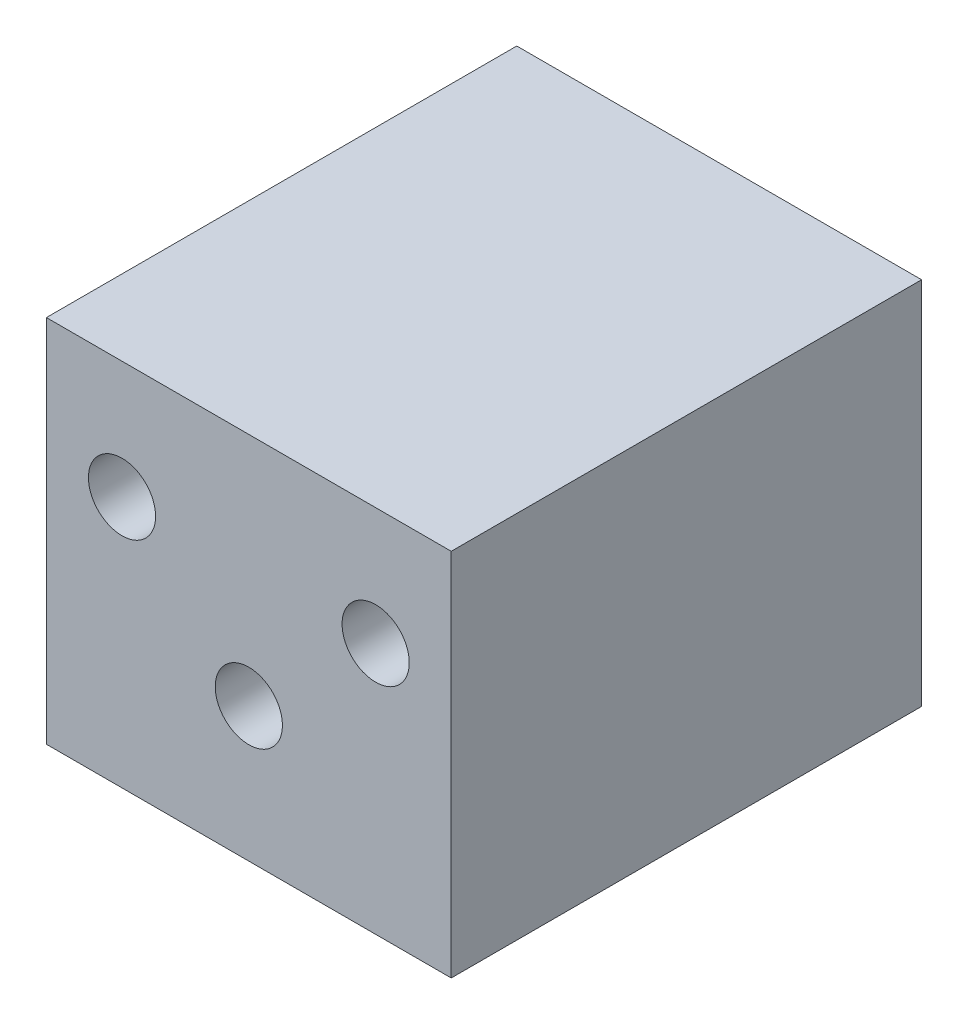
ISO-10303-21;
HEADER;
FILE_DESCRIPTION(('STEP AP214'),'2;1');
FILE_NAME('part.step','',(''),(''),'','','');
FILE_SCHEMA(('AUTOMOTIVE_DESIGN { 1 0 10303 214 1 1 1 1 }'));
ENDSEC;
DATA;
#1=APPLICATION_CONTEXT('core data for automotive mechanical design processes');
#2=APPLICATION_PROTOCOL_DEFINITION('international standard','automotive_design',2000,#1);
#3=PRODUCT_CONTEXT('',#1,'mechanical');
#4=PRODUCT('Part','Part','',(#3));
#5=PRODUCT_RELATED_PRODUCT_CATEGORY('part','',(#4));
#6=PRODUCT_DEFINITION_FORMATION('','',#4);
#7=PRODUCT_DEFINITION_CONTEXT('part definition',#1,'design');
#8=PRODUCT_DEFINITION('design','',#6,#7);
#9=PRODUCT_DEFINITION_SHAPE('','',#8);
#10=(LENGTH_UNIT() NAMED_UNIT(*) SI_UNIT(.MILLI.,.METRE.));
#11=(NAMED_UNIT(*) PLANE_ANGLE_UNIT() SI_UNIT($,.RADIAN.));
#12=(NAMED_UNIT(*) SI_UNIT($,.STERADIAN.) SOLID_ANGLE_UNIT());
#13=UNCERTAINTY_MEASURE_WITH_UNIT(LENGTH_MEASURE(1.E-05),#10,'distance_accuracy_value','');
#14=(GEOMETRIC_REPRESENTATION_CONTEXT(3) GLOBAL_UNCERTAINTY_ASSIGNED_CONTEXT((#13)) GLOBAL_UNIT_ASSIGNED_CONTEXT((#10,
#11,#12)) REPRESENTATION_CONTEXT('',''));
#15=CARTESIAN_POINT('',(0.,0.,0.));
#16=DIRECTION('',(0.,0.,1.));
#17=DIRECTION('',(1.,0.,0.));
#18=AXIS2_PLACEMENT_3D('',#15,#16,#17);
#19=CARTESIAN_POINT('',(0.,0.,28.));
#20=DIRECTION('',(0.,0.,1.));
#21=DIRECTION('',(1.,0.,0.));
#22=AXIS2_PLACEMENT_3D('',#19,#20,#21);
#23=PLANE('',#22);
#24=CARTESIAN_POINT('',(0.,-3.,28.));
#25=DIRECTION('',(0.,0.,1.));
#26=DIRECTION('',(1.,0.,0.));
#27=AXIS2_PLACEMENT_3D('',#24,#25,#26);
#28=CIRCLE('',#27,2.);
#29=CARTESIAN_POINT('',(2.,-3.,28.));
#30=VERTEX_POINT('',#29);
#31=EDGE_CURVE('E152',#30,#30,#28,.T.);
#32=ORIENTED_EDGE('',*,*,#31,.F.);
#33=EDGE_LOOP('',(#32));
#34=FACE_BOUND('',#33,.T.);
#35=CARTESIAN_POINT('',(-7.55,4.,28.));
#36=DIRECTION('',(0.,0.,1.));
#37=DIRECTION('',(1.,0.,0.));
#38=AXIS2_PLACEMENT_3D('',#35,#36,#37);
#39=CIRCLE('',#38,2.);
#40=CARTESIAN_POINT('',(-5.55,4.,28.));
#41=VERTEX_POINT('',#40);
#42=EDGE_CURVE('E118',#41,#41,#39,.T.);
#43=ORIENTED_EDGE('',*,*,#42,.F.);
#44=EDGE_LOOP('',(#43));
#45=FACE_BOUND('',#44,.T.);
#46=DIRECTION('',(0.,1.,0.));
#47=VECTOR('',#46,1.);
#48=CARTESIAN_POINT('',(12.05,11.,28.));
#49=LINE('',#48,#47);
#50=CARTESIAN_POINT('',(12.05,-11.,28.));
#51=VERTEX_POINT('',#50);
#52=CARTESIAN_POINT('',(12.05,11.,28.));
#53=VERTEX_POINT('',#52);
#54=EDGE_CURVE('E98',#51,#53,#49,.T.);
#55=ORIENTED_EDGE('',*,*,#54,.T.);
#56=DIRECTION('',(-1.,0.,0.));
#57=VECTOR('',#56,1.);
#58=CARTESIAN_POINT('',(-12.05,11.,28.));
#59=LINE('',#58,#57);
#60=CARTESIAN_POINT('',(-12.05,11.,28.));
#61=VERTEX_POINT('',#60);
#62=EDGE_CURVE('E93',#53,#61,#59,.T.);
#63=ORIENTED_EDGE('',*,*,#62,.T.);
#64=DIRECTION('',(0.,-1.,0.));
#65=VECTOR('',#64,1.);
#66=CARTESIAN_POINT('',(-12.05,11.,28.));
#67=LINE('',#66,#65);
#68=CARTESIAN_POINT('',(-12.05,-11.,28.));
#69=VERTEX_POINT('',#68);
#70=EDGE_CURVE('E96',#61,#69,#67,.T.);
#71=ORIENTED_EDGE('',*,*,#70,.T.);
#72=DIRECTION('',(1.,0.,0.));
#73=VECTOR('',#72,1.);
#74=CARTESIAN_POINT('',(-12.05,-11.,28.));
#75=LINE('',#74,#73);
#76=EDGE_CURVE('E63',#69,#51,#75,.T.);
#77=ORIENTED_EDGE('',*,*,#76,.T.);
#78=EDGE_LOOP('',(#55,#63,#71,#77));
#79=FACE_BOUND('',#78,.T.);
#80=CARTESIAN_POINT('',(7.55,4.,28.));
#81=DIRECTION('',(0.,0.,1.));
#82=DIRECTION('',(1.,0.,0.));
#83=AXIS2_PLACEMENT_3D('',#80,#81,#82);
#84=CIRCLE('',#83,2.);
#85=CARTESIAN_POINT('',(9.55,4.,28.));
#86=VERTEX_POINT('',#85);
#87=EDGE_CURVE('E140',#86,#86,#84,.T.);
#88=ORIENTED_EDGE('',*,*,#87,.F.);
#89=EDGE_LOOP('',(#88));
#90=FACE_BOUND('',#89,.T.);
#91=ADVANCED_FACE('F45',(#34,#45,#79,#90),#23,.T.);
#92=CARTESIAN_POINT('',(0.,0.,0.));
#93=DIRECTION('',(0.,0.,1.));
#94=DIRECTION('',(1.,0.,0.));
#95=AXIS2_PLACEMENT_3D('',#92,#93,#94);
#96=PLANE('',#95);
#97=DIRECTION('',(0.,1.,0.));
#98=VECTOR('',#97,1.);
#99=CARTESIAN_POINT('',(12.05,11.,0.));
#100=LINE('',#99,#98);
#101=CARTESIAN_POINT('',(12.05,-11.,0.));
#102=VERTEX_POINT('',#101);
#103=CARTESIAN_POINT('',(12.05,11.,0.));
#104=VERTEX_POINT('',#103);
#105=EDGE_CURVE('E114',#102,#104,#100,.T.);
#106=ORIENTED_EDGE('',*,*,#105,.F.);
#107=DIRECTION('',(1.,0.,0.));
#108=VECTOR('',#107,1.);
#109=CARTESIAN_POINT('',(-12.05,-11.,0.));
#110=LINE('',#109,#108);
#111=CARTESIAN_POINT('',(-12.05,-11.,0.));
#112=VERTEX_POINT('',#111);
#113=EDGE_CURVE('E86',#112,#102,#110,.T.);
#114=ORIENTED_EDGE('',*,*,#113,.F.);
#115=DIRECTION('',(0.,-1.,0.));
#116=VECTOR('',#115,1.);
#117=CARTESIAN_POINT('',(-12.05,11.,0.));
#118=LINE('',#117,#116);
#119=CARTESIAN_POINT('',(-12.05,11.,0.));
#120=VERTEX_POINT('',#119);
#121=EDGE_CURVE('E80',#120,#112,#118,.T.);
#122=ORIENTED_EDGE('',*,*,#121,.F.);
#123=DIRECTION('',(-1.,0.,0.));
#124=VECTOR('',#123,1.);
#125=CARTESIAN_POINT('',(-12.05,11.,0.));
#126=LINE('',#125,#124);
#127=EDGE_CURVE('E103',#104,#120,#126,.T.);
#128=ORIENTED_EDGE('',*,*,#127,.F.);
#129=EDGE_LOOP('',(#106,#114,#122,#128));
#130=FACE_BOUND('',#129,.T.);
#131=CARTESIAN_POINT('',(-7.55,4.,0.));
#132=DIRECTION('',(0.,0.,1.));
#133=DIRECTION('',(1.,0.,0.));
#134=AXIS2_PLACEMENT_3D('',#131,#132,#133);
#135=CIRCLE('',#134,2.);
#136=CARTESIAN_POINT('',(-5.55,4.,0.));
#137=VERTEX_POINT('',#136);
#138=EDGE_CURVE('E136',#137,#137,#135,.T.);
#139=ORIENTED_EDGE('',*,*,#138,.T.);
#140=EDGE_LOOP('',(#139));
#141=FACE_BOUND('',#140,.T.);
#142=CARTESIAN_POINT('',(7.55,4.,0.));
#143=DIRECTION('',(0.,0.,1.));
#144=DIRECTION('',(1.,0.,0.));
#145=AXIS2_PLACEMENT_3D('',#142,#143,#144);
#146=CIRCLE('',#145,2.);
#147=CARTESIAN_POINT('',(9.55,4.,0.));
#148=VERTEX_POINT('',#147);
#149=EDGE_CURVE('E144',#148,#148,#146,.T.);
#150=ORIENTED_EDGE('',*,*,#149,.T.);
#151=EDGE_LOOP('',(#150));
#152=FACE_BOUND('',#151,.T.);
#153=ADVANCED_FACE('F131',(#130,#141,#152),#96,.F.);
#154=CARTESIAN_POINT('',(12.05,11.,28.));
#155=DIRECTION('',(-1.,0.,0.));
#156=DIRECTION('',(0.,-1.,0.));
#157=AXIS2_PLACEMENT_3D('',#154,#155,#156);
#158=PLANE('',#157);
#159=ORIENTED_EDGE('',*,*,#105,.T.);
#160=DIRECTION('',(0.,0.,-1.));
#161=VECTOR('',#160,1.);
#162=CARTESIAN_POINT('',(12.05,11.,28.));
#163=LINE('',#162,#161);
#164=EDGE_CURVE('E11',#53,#104,#163,.T.);
#165=ORIENTED_EDGE('',*,*,#164,.F.);
#166=ORIENTED_EDGE('',*,*,#54,.F.);
#167=DIRECTION('',(0.,0.,-1.));
#168=VECTOR('',#167,1.);
#169=CARTESIAN_POINT('',(12.05,-11.,28.));
#170=LINE('',#169,#168);
#171=EDGE_CURVE('E110',#51,#102,#170,.T.);
#172=ORIENTED_EDGE('',*,*,#171,.T.);
#173=EDGE_LOOP('',(#159,#165,#166,#172));
#174=FACE_BOUND('',#173,.T.);
#175=ADVANCED_FACE('F47',(#174),#158,.F.);
#176=CARTESIAN_POINT('',(-12.05,11.,28.));
#177=DIRECTION('',(0.,-1.,0.));
#178=DIRECTION('',(0.,0.,-1.));
#179=AXIS2_PLACEMENT_3D('',#176,#177,#178);
#180=PLANE('',#179);
#181=ORIENTED_EDGE('',*,*,#127,.T.);
#182=DIRECTION('',(0.,0.,-1.));
#183=VECTOR('',#182,1.);
#184=CARTESIAN_POINT('',(-12.05,11.,28.));
#185=LINE('',#184,#183);
#186=EDGE_CURVE('E55',#61,#120,#185,.T.);
#187=ORIENTED_EDGE('',*,*,#186,.F.);
#188=ORIENTED_EDGE('',*,*,#62,.F.);
#189=ORIENTED_EDGE('',*,*,#164,.T.);
#190=EDGE_LOOP('',(#181,#187,#188,#189));
#191=FACE_BOUND('',#190,.T.);
#192=ADVANCED_FACE('F102',(#191),#180,.F.);
#193=CARTESIAN_POINT('',(-12.05,11.,28.));
#194=DIRECTION('',(1.,0.,0.));
#195=DIRECTION('',(0.,1.,0.));
#196=AXIS2_PLACEMENT_3D('',#193,#194,#195);
#197=PLANE('',#196);
#198=ORIENTED_EDGE('',*,*,#121,.T.);
#199=DIRECTION('',(0.,0.,-1.));
#200=VECTOR('',#199,1.);
#201=CARTESIAN_POINT('',(-12.05,-11.,28.));
#202=LINE('',#201,#200);
#203=EDGE_CURVE('E105',#69,#112,#202,.T.);
#204=ORIENTED_EDGE('',*,*,#203,.F.);
#205=ORIENTED_EDGE('',*,*,#70,.F.);
#206=ORIENTED_EDGE('',*,*,#186,.T.);
#207=EDGE_LOOP('',(#198,#204,#205,#206));
#208=FACE_BOUND('',#207,.T.);
#209=ADVANCED_FACE('F106',(#208),#197,.F.);
#210=CARTESIAN_POINT('',(-12.05,-11.,28.));
#211=DIRECTION('',(0.,1.,0.));
#212=DIRECTION('',(0.,0.,1.));
#213=AXIS2_PLACEMENT_3D('',#210,#211,#212);
#214=PLANE('',#213);
#215=ORIENTED_EDGE('',*,*,#113,.T.);
#216=ORIENTED_EDGE('',*,*,#171,.F.);
#217=ORIENTED_EDGE('',*,*,#76,.F.);
#218=ORIENTED_EDGE('',*,*,#203,.T.);
#219=EDGE_LOOP('',(#215,#216,#217,#218));
#220=FACE_BOUND('',#219,.T.);
#221=ADVANCED_FACE('F128',(#220),#214,.F.);
#222=CARTESIAN_POINT('',(-7.55,4.,28.));
#223=DIRECTION('',(0.,0.,-1.));
#224=DIRECTION('',(-1.,0.,0.));
#225=AXIS2_PLACEMENT_3D('',#222,#223,#224);
#226=CYLINDRICAL_SURFACE('',#225,2.);
#227=ORIENTED_EDGE('',*,*,#42,.T.);
#228=EDGE_LOOP('',(#227));
#229=FACE_BOUND('',#228,.T.);
#230=ORIENTED_EDGE('',*,*,#138,.F.);
#231=EDGE_LOOP('',(#230));
#232=FACE_BOUND('',#231,.T.);
#233=ADVANCED_FACE('F174',(#229,#232),#226,.F.);
#234=CARTESIAN_POINT('',(7.55,4.,28.));
#235=DIRECTION('',(0.,0.,-1.));
#236=DIRECTION('',(-1.,0.,0.));
#237=AXIS2_PLACEMENT_3D('',#234,#235,#236);
#238=CYLINDRICAL_SURFACE('',#237,2.);
#239=ORIENTED_EDGE('',*,*,#87,.T.);
#240=EDGE_LOOP('',(#239));
#241=FACE_BOUND('',#240,.T.);
#242=ORIENTED_EDGE('',*,*,#149,.F.);
#243=EDGE_LOOP('',(#242));
#244=FACE_BOUND('',#243,.T.);
#245=ADVANCED_FACE('F165',(#241,#244),#238,.F.);
#246=CARTESIAN_POINT('',(0.,-3.,25.));
#247=DIRECTION('',(0.,0.,1.));
#248=DIRECTION('',(1.,0.,0.));
#249=AXIS2_PLACEMENT_3D('',#246,#247,#248);
#250=CYLINDRICAL_SURFACE('',#249,2.);
#251=CARTESIAN_POINT('',(0.,-3.,25.));
#252=DIRECTION('',(0.,0.,1.));
#253=DIRECTION('',(1.,0.,0.));
#254=AXIS2_PLACEMENT_3D('',#251,#252,#253);
#255=CIRCLE('',#254,2.);
#256=CARTESIAN_POINT('',(2.,-3.,25.));
#257=VERTEX_POINT('',#256);
#258=EDGE_CURVE('E148',#257,#257,#255,.T.);
#259=ORIENTED_EDGE('',*,*,#258,.F.);
#260=EDGE_LOOP('',(#259));
#261=FACE_BOUND('',#260,.T.);
#262=ORIENTED_EDGE('',*,*,#31,.T.);
#263=EDGE_LOOP('',(#262));
#264=FACE_BOUND('',#263,.T.);
#265=ADVANCED_FACE('F162',(#261,#264),#250,.F.);
#266=CARTESIAN_POINT('',(0.,-3.,25.));
#267=DIRECTION('',(0.,0.,1.));
#268=DIRECTION('',(1.,0.,0.));
#269=AXIS2_PLACEMENT_3D('',#266,#267,#268);
#270=PLANE('',#269);
#271=ORIENTED_EDGE('',*,*,#258,.T.);
#272=EDGE_LOOP('',(#271));
#273=FACE_BOUND('',#272,.T.);
#274=ADVANCED_FACE('F160',(#273),#270,.T.);
#275=CLOSED_SHELL('',(#91,#153,#175,#192,#209,#221,#233,#245,#265,#274));
#276=MANIFOLD_SOLID_BREP('B2',#275);
#277=ADVANCED_BREP_SHAPE_REPRESENTATION('',(#18,#276),#14);
#278=SHAPE_DEFINITION_REPRESENTATION(#9,#277);
ENDSEC;
END-ISO-10303-21;
